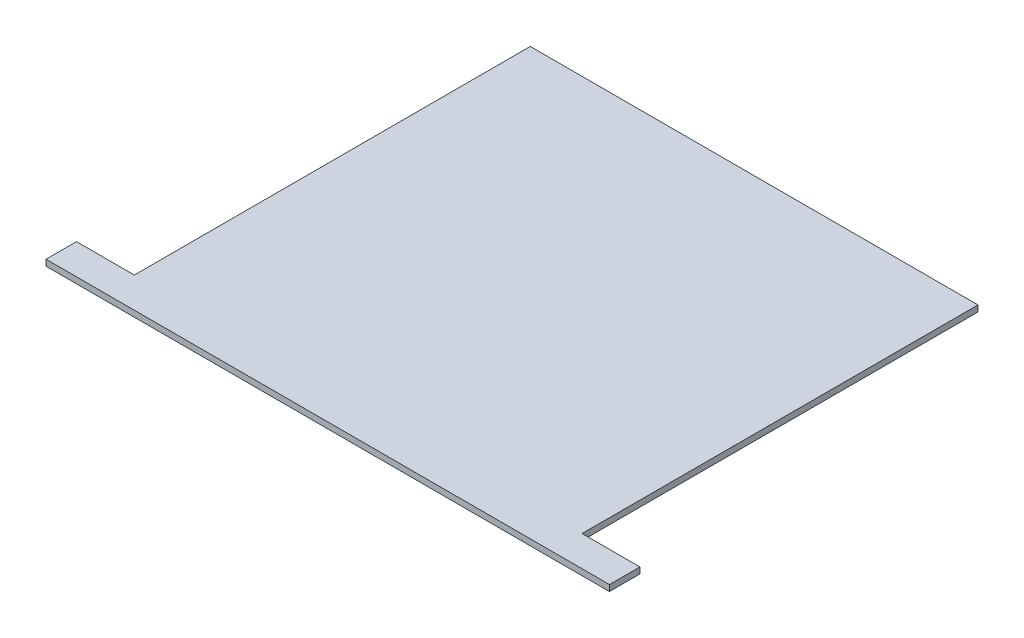
ISO-10303-21;
HEADER;
FILE_DESCRIPTION(('STEP AP214'),'2;1');
FILE_NAME('part.step','',(''),(''),'','','');
FILE_SCHEMA(('AUTOMOTIVE_DESIGN { 1 0 10303 214 1 1 1 1 }'));
ENDSEC;
DATA;
#1=APPLICATION_CONTEXT('core data for automotive mechanical design processes');
#2=APPLICATION_PROTOCOL_DEFINITION('international standard','automotive_design',2000,#1);
#3=PRODUCT_CONTEXT('',#1,'mechanical');
#4=PRODUCT('Part','Part','',(#3));
#5=PRODUCT_RELATED_PRODUCT_CATEGORY('part','',(#4));
#6=PRODUCT_DEFINITION_FORMATION('','',#4);
#7=PRODUCT_DEFINITION_CONTEXT('part definition',#1,'design');
#8=PRODUCT_DEFINITION('design','',#6,#7);
#9=PRODUCT_DEFINITION_SHAPE('','',#8);
#10=(LENGTH_UNIT() NAMED_UNIT(*) SI_UNIT(.MILLI.,.METRE.));
#11=(NAMED_UNIT(*) PLANE_ANGLE_UNIT() SI_UNIT($,.RADIAN.));
#12=(NAMED_UNIT(*) SI_UNIT($,.STERADIAN.) SOLID_ANGLE_UNIT());
#13=UNCERTAINTY_MEASURE_WITH_UNIT(LENGTH_MEASURE(1.E-05),#10,'distance_accuracy_value','');
#14=(GEOMETRIC_REPRESENTATION_CONTEXT(3) GLOBAL_UNCERTAINTY_ASSIGNED_CONTEXT((#13)) GLOBAL_UNIT_ASSIGNED_CONTEXT((#10,
#11,#12)) REPRESENTATION_CONTEXT('',''));
#15=CARTESIAN_POINT('',(0.,0.,0.));
#16=DIRECTION('',(0.,0.,1.));
#17=DIRECTION('',(1.,0.,0.));
#18=AXIS2_PLACEMENT_3D('',#15,#16,#17);
#19=CARTESIAN_POINT('',(-53.967841376305,2.,-27.3070814149567));
#20=DIRECTION('',(0.,0.,1.));
#21=DIRECTION('',(1.,0.,0.));
#22=AXIS2_PLACEMENT_3D('',#19,#20,#21);
#23=PLANE('',#22);
#24=DIRECTION('',(0.,-1.,0.));
#25=VECTOR('',#24,1.);
#26=CARTESIAN_POINT('',(112.032158623695,2.,-27.3070814149567));
#27=LINE('',#26,#25);
#28=CARTESIAN_POINT('',(112.032158623695,2.,-27.3070814149567));
#29=VERTEX_POINT('',#28);
#30=CARTESIAN_POINT('',(112.032158623695,0.,-27.3070814149567));
#31=VERTEX_POINT('',#30);
#32=EDGE_CURVE('E101',#29,#31,#27,.T.);
#33=ORIENTED_EDGE('',*,*,#32,.T.);
#34=DIRECTION('',(-1.,0.,0.));
#35=VECTOR('',#34,1.);
#36=CARTESIAN_POINT('',(-53.967841376305,0.,-27.3070814149567));
#37=LINE('',#36,#35);
#38=CARTESIAN_POINT('',(-34.967841376305,0.,-27.3070814149567));
#39=VERTEX_POINT('',#38);
#40=EDGE_CURVE('E58',#31,#39,#37,.T.);
#41=ORIENTED_EDGE('',*,*,#40,.T.);
#42=DIRECTION('',(0.,-1.,0.));
#43=VECTOR('',#42,1.);
#44=CARTESIAN_POINT('',(-34.967841376305,2.,-27.3070814149567));
#45=LINE('',#44,#43);
#46=CARTESIAN_POINT('',(-34.967841376305,2.,-27.3070814149567));
#47=VERTEX_POINT('',#46);
#48=EDGE_CURVE('E119',#47,#39,#45,.T.);
#49=ORIENTED_EDGE('',*,*,#48,.F.);
#50=DIRECTION('',(-1.,0.,0.));
#51=VECTOR('',#50,1.);
#52=CARTESIAN_POINT('',(-53.967841376305,2.,-27.3070814149567));
#53=LINE('',#52,#51);
#54=EDGE_CURVE('E114',#29,#47,#53,.T.);
#55=ORIENTED_EDGE('',*,*,#54,.F.);
#56=EDGE_LOOP('',(#33,#41,#49,#55));
#57=FACE_BOUND('',#56,.T.);
#58=ADVANCED_FACE('F35',(#57),#23,.F.);
#59=CARTESIAN_POINT('',(0.,2.,0.));
#60=DIRECTION('',(0.,1.,0.));
#61=DIRECTION('',(0.,0.,1.));
#62=AXIS2_PLACEMENT_3D('',#59,#60,#61);
#63=PLANE('',#62);
#64=DIRECTION('',(1.,0.,0.));
#65=VECTOR('',#64,1.);
#66=CARTESIAN_POINT('',(131.032158623695,2.,102.692918585043));
#67=LINE('',#66,#65);
#68=CARTESIAN_POINT('',(112.032158623695,2.,102.692918585043));
#69=VERTEX_POINT('',#68);
#70=CARTESIAN_POINT('',(131.032158623695,2.,102.692918585043));
#71=VERTEX_POINT('',#70);
#72=EDGE_CURVE('E50',#69,#71,#67,.T.);
#73=ORIENTED_EDGE('',*,*,#72,.F.);
#74=DIRECTION('',(0.,0.,1.));
#75=VECTOR('',#74,1.);
#76=CARTESIAN_POINT('',(112.032158623695,2.,-27.3070814149567));
#77=LINE('',#76,#75);
#78=EDGE_CURVE('E104',#29,#69,#77,.T.);
#79=ORIENTED_EDGE('',*,*,#78,.F.);
#80=ORIENTED_EDGE('',*,*,#54,.T.);
#81=DIRECTION('',(0.,0.,-1.));
#82=VECTOR('',#81,1.);
#83=CARTESIAN_POINT('',(-34.967841376305,2.,-27.3070814149567));
#84=LINE('',#83,#82);
#85=CARTESIAN_POINT('',(-34.967841376305,2.,102.692918585043));
#86=VERTEX_POINT('',#85);
#87=EDGE_CURVE('E146',#86,#47,#84,.T.);
#88=ORIENTED_EDGE('',*,*,#87,.F.);
#89=DIRECTION('',(1.,0.,0.));
#90=VECTOR('',#89,1.);
#91=CARTESIAN_POINT('',(-53.967841376305,2.,102.692918585043));
#92=LINE('',#91,#90);
#93=CARTESIAN_POINT('',(-53.967841376305,2.,102.692918585043));
#94=VERTEX_POINT('',#93);
#95=EDGE_CURVE('E150',#94,#86,#92,.T.);
#96=ORIENTED_EDGE('',*,*,#95,.F.);
#97=DIRECTION('',(0.,0.,1.));
#98=VECTOR('',#97,1.);
#99=CARTESIAN_POINT('',(-53.967841376305,2.,-27.3070814149567));
#100=LINE('',#99,#98);
#101=CARTESIAN_POINT('',(-53.967841376305,2.,112.692918585043));
#102=VERTEX_POINT('',#101);
#103=EDGE_CURVE('E135',#94,#102,#100,.T.);
#104=ORIENTED_EDGE('',*,*,#103,.T.);
#105=DIRECTION('',(1.,0.,0.));
#106=VECTOR('',#105,1.);
#107=CARTESIAN_POINT('',(-53.967841376305,2.,112.692918585043));
#108=LINE('',#107,#106);
#109=CARTESIAN_POINT('',(131.032158623695,2.,112.692918585043));
#110=VERTEX_POINT('',#109);
#111=EDGE_CURVE('E123',#102,#110,#108,.T.);
#112=ORIENTED_EDGE('',*,*,#111,.T.);
#113=DIRECTION('',(0.,0.,-1.));
#114=VECTOR('',#113,1.);
#115=CARTESIAN_POINT('',(131.032158623695,2.,-27.3070814149567));
#116=LINE('',#115,#114);
#117=EDGE_CURVE('E120',#110,#71,#116,.T.);
#118=ORIENTED_EDGE('',*,*,#117,.T.);
#119=EDGE_LOOP('',(#73,#79,#80,#88,#96,#104,#112,#118));
#120=FACE_BOUND('',#119,.T.);
#121=ADVANCED_FACE('F112',(#120),#63,.T.);
#122=CARTESIAN_POINT('',(0.,0.,0.));
#123=DIRECTION('',(0.,1.,0.));
#124=DIRECTION('',(0.,0.,1.));
#125=AXIS2_PLACEMENT_3D('',#122,#123,#124);
#126=PLANE('',#125);
#127=DIRECTION('',(0.,0.,1.));
#128=VECTOR('',#127,1.);
#129=CARTESIAN_POINT('',(112.032158623695,0.,-27.3070814149567));
#130=LINE('',#129,#128);
#131=CARTESIAN_POINT('',(112.032158623695,0.,102.692918585043));
#132=VERTEX_POINT('',#131);
#133=EDGE_CURVE('E106',#31,#132,#130,.T.);
#134=ORIENTED_EDGE('',*,*,#133,.T.);
#135=DIRECTION('',(1.,0.,0.));
#136=VECTOR('',#135,1.);
#137=CARTESIAN_POINT('',(131.032158623695,0.,102.692918585043));
#138=LINE('',#137,#136);
#139=CARTESIAN_POINT('',(131.032158623695,0.,102.692918585043));
#140=VERTEX_POINT('',#139);
#141=EDGE_CURVE('E117',#132,#140,#138,.T.);
#142=ORIENTED_EDGE('',*,*,#141,.T.);
#143=DIRECTION('',(0.,0.,-1.));
#144=VECTOR('',#143,1.);
#145=CARTESIAN_POINT('',(131.032158623695,0.,-27.3070814149567));
#146=LINE('',#145,#144);
#147=CARTESIAN_POINT('',(131.032158623695,0.,112.692918585043));
#148=VERTEX_POINT('',#147);
#149=EDGE_CURVE('E132',#148,#140,#146,.T.);
#150=ORIENTED_EDGE('',*,*,#149,.F.);
#151=DIRECTION('',(1.,0.,0.));
#152=VECTOR('',#151,1.);
#153=CARTESIAN_POINT('',(-53.967841376305,0.,112.692918585043));
#154=LINE('',#153,#152);
#155=CARTESIAN_POINT('',(-53.967841376305,0.,112.692918585043));
#156=VERTEX_POINT('',#155);
#157=EDGE_CURVE('E129',#156,#148,#154,.T.);
#158=ORIENTED_EDGE('',*,*,#157,.F.);
#159=DIRECTION('',(0.,0.,1.));
#160=VECTOR('',#159,1.);
#161=CARTESIAN_POINT('',(-53.967841376305,0.,-27.3070814149567));
#162=LINE('',#161,#160);
#163=CARTESIAN_POINT('',(-53.967841376305,0.,102.692918585043));
#164=VERTEX_POINT('',#163);
#165=EDGE_CURVE('E127',#164,#156,#162,.T.);
#166=ORIENTED_EDGE('',*,*,#165,.F.);
#167=DIRECTION('',(1.,0.,0.));
#168=VECTOR('',#167,1.);
#169=CARTESIAN_POINT('',(-53.967841376305,0.,102.692918585043));
#170=LINE('',#169,#168);
#171=CARTESIAN_POINT('',(-34.967841376305,0.,102.692918585043));
#172=VERTEX_POINT('',#171);
#173=EDGE_CURVE('E108',#164,#172,#170,.T.);
#174=ORIENTED_EDGE('',*,*,#173,.T.);
#175=DIRECTION('',(0.,0.,-1.));
#176=VECTOR('',#175,1.);
#177=CARTESIAN_POINT('',(-34.967841376305,0.,-27.3070814149567));
#178=LINE('',#177,#176);
#179=EDGE_CURVE('E147',#172,#39,#178,.T.);
#180=ORIENTED_EDGE('',*,*,#179,.T.);
#181=ORIENTED_EDGE('',*,*,#40,.F.);
#182=EDGE_LOOP('',(#134,#142,#150,#158,#166,#174,#180,#181));
#183=FACE_BOUND('',#182,.T.);
#184=ADVANCED_FACE('F162',(#183),#126,.F.);
#185=CARTESIAN_POINT('',(131.032158623695,2.,-27.3070814149567));
#186=DIRECTION('',(-1.,0.,0.));
#187=DIRECTION('',(0.,0.,1.));
#188=AXIS2_PLACEMENT_3D('',#185,#186,#187);
#189=PLANE('',#188);
#190=DIRECTION('',(0.,-1.,0.));
#191=VECTOR('',#190,1.);
#192=CARTESIAN_POINT('',(131.032158623695,2.,102.692918585043));
#193=LINE('',#192,#191);
#194=EDGE_CURVE('E156',#71,#140,#193,.T.);
#195=ORIENTED_EDGE('',*,*,#194,.F.);
#196=ORIENTED_EDGE('',*,*,#117,.F.);
#197=DIRECTION('',(0.,-1.,0.));
#198=VECTOR('',#197,1.);
#199=CARTESIAN_POINT('',(131.032158623695,2.,112.692918585043));
#200=LINE('',#199,#198);
#201=EDGE_CURVE('E43',#110,#148,#200,.T.);
#202=ORIENTED_EDGE('',*,*,#201,.T.);
#203=ORIENTED_EDGE('',*,*,#149,.T.);
#204=EDGE_LOOP('',(#195,#196,#202,#203));
#205=FACE_BOUND('',#204,.T.);
#206=ADVANCED_FACE('F179',(#205),#189,.F.);
#207=CARTESIAN_POINT('',(-53.967841376305,2.,-27.3070814149567));
#208=DIRECTION('',(1.,0.,0.));
#209=DIRECTION('',(0.,0.,-1.));
#210=AXIS2_PLACEMENT_3D('',#207,#208,#209);
#211=PLANE('',#210);
#212=DIRECTION('',(0.,-1.,0.));
#213=VECTOR('',#212,1.);
#214=CARTESIAN_POINT('',(-53.967841376305,2.,102.692918585043));
#215=LINE('',#214,#213);
#216=EDGE_CURVE('E130',#94,#164,#215,.T.);
#217=ORIENTED_EDGE('',*,*,#216,.T.);
#218=ORIENTED_EDGE('',*,*,#165,.T.);
#219=DIRECTION('',(0.,-1.,0.));
#220=VECTOR('',#219,1.);
#221=CARTESIAN_POINT('',(-53.967841376305,2.,112.692918585043));
#222=LINE('',#221,#220);
#223=EDGE_CURVE('E11',#102,#156,#222,.T.);
#224=ORIENTED_EDGE('',*,*,#223,.F.);
#225=ORIENTED_EDGE('',*,*,#103,.F.);
#226=EDGE_LOOP('',(#217,#218,#224,#225));
#227=FACE_BOUND('',#226,.T.);
#228=ADVANCED_FACE('F37',(#227),#211,.F.);
#229=CARTESIAN_POINT('',(-53.967841376305,2.,112.692918585043));
#230=DIRECTION('',(0.,0.,-1.));
#231=DIRECTION('',(-1.,0.,0.));
#232=AXIS2_PLACEMENT_3D('',#229,#230,#231);
#233=PLANE('',#232);
#234=ORIENTED_EDGE('',*,*,#157,.T.);
#235=ORIENTED_EDGE('',*,*,#201,.F.);
#236=ORIENTED_EDGE('',*,*,#111,.F.);
#237=ORIENTED_EDGE('',*,*,#223,.T.);
#238=EDGE_LOOP('',(#234,#235,#236,#237));
#239=FACE_BOUND('',#238,.T.);
#240=ADVANCED_FACE('F175',(#239),#233,.F.);
#241=CARTESIAN_POINT('',(-53.967841376305,2.,102.692918585043));
#242=DIRECTION('',(0.,0.,-1.));
#243=DIRECTION('',(-1.,0.,0.));
#244=AXIS2_PLACEMENT_3D('',#241,#242,#243);
#245=PLANE('',#244);
#246=ORIENTED_EDGE('',*,*,#173,.F.);
#247=ORIENTED_EDGE('',*,*,#216,.F.);
#248=ORIENTED_EDGE('',*,*,#95,.T.);
#249=DIRECTION('',(0.,-1.,0.));
#250=VECTOR('',#249,1.);
#251=CARTESIAN_POINT('',(-34.967841376305,2.,102.692918585043));
#252=LINE('',#251,#250);
#253=EDGE_CURVE('E143',#86,#172,#252,.T.);
#254=ORIENTED_EDGE('',*,*,#253,.T.);
#255=EDGE_LOOP('',(#246,#247,#248,#254));
#256=FACE_BOUND('',#255,.T.);
#257=ADVANCED_FACE('F197',(#256),#245,.T.);
#258=CARTESIAN_POINT('',(-34.967841376305,2.,-27.3070814149567));
#259=DIRECTION('',(-1.,0.,0.));
#260=DIRECTION('',(0.,0.,1.));
#261=AXIS2_PLACEMENT_3D('',#258,#259,#260);
#262=PLANE('',#261);
#263=ORIENTED_EDGE('',*,*,#179,.F.);
#264=ORIENTED_EDGE('',*,*,#253,.F.);
#265=ORIENTED_EDGE('',*,*,#87,.T.);
#266=ORIENTED_EDGE('',*,*,#48,.T.);
#267=EDGE_LOOP('',(#263,#264,#265,#266));
#268=FACE_BOUND('',#267,.T.);
#269=ADVANCED_FACE('F169',(#268),#262,.T.);
#270=CARTESIAN_POINT('',(112.032158623695,2.,-27.3070814149567));
#271=DIRECTION('',(1.,0.,0.));
#272=DIRECTION('',(0.,0.,-1.));
#273=AXIS2_PLACEMENT_3D('',#270,#271,#272);
#274=PLANE('',#273);
#275=ORIENTED_EDGE('',*,*,#133,.F.);
#276=ORIENTED_EDGE('',*,*,#32,.F.);
#277=ORIENTED_EDGE('',*,*,#78,.T.);
#278=DIRECTION('',(0.,-1.,0.));
#279=VECTOR('',#278,1.);
#280=CARTESIAN_POINT('',(112.032158623695,2.,102.692918585043));
#281=LINE('',#280,#279);
#282=EDGE_CURVE('E109',#69,#132,#281,.T.);
#283=ORIENTED_EDGE('',*,*,#282,.T.);
#284=EDGE_LOOP('',(#275,#276,#277,#283));
#285=FACE_BOUND('',#284,.T.);
#286=ADVANCED_FACE('F103',(#285),#274,.T.);
#287=CARTESIAN_POINT('',(131.032158623695,2.,102.692918585043));
#288=DIRECTION('',(0.,0.,-1.));
#289=DIRECTION('',(-1.,0.,0.));
#290=AXIS2_PLACEMENT_3D('',#287,#288,#289);
#291=PLANE('',#290);
#292=ORIENTED_EDGE('',*,*,#141,.F.);
#293=ORIENTED_EDGE('',*,*,#282,.F.);
#294=ORIENTED_EDGE('',*,*,#72,.T.);
#295=ORIENTED_EDGE('',*,*,#194,.T.);
#296=EDGE_LOOP('',(#292,#293,#294,#295));
#297=FACE_BOUND('',#296,.T.);
#298=ADVANCED_FACE('F180',(#297),#291,.T.);
#299=CLOSED_SHELL('',(#58,#121,#184,#206,#228,#240,#257,#269,#286,#298));
#300=MANIFOLD_SOLID_BREP('B2',#299);
#301=ADVANCED_BREP_SHAPE_REPRESENTATION('',(#18,#300),#14);
#302=SHAPE_DEFINITION_REPRESENTATION(#9,#301);
ENDSEC;
END-ISO-10303-21;
